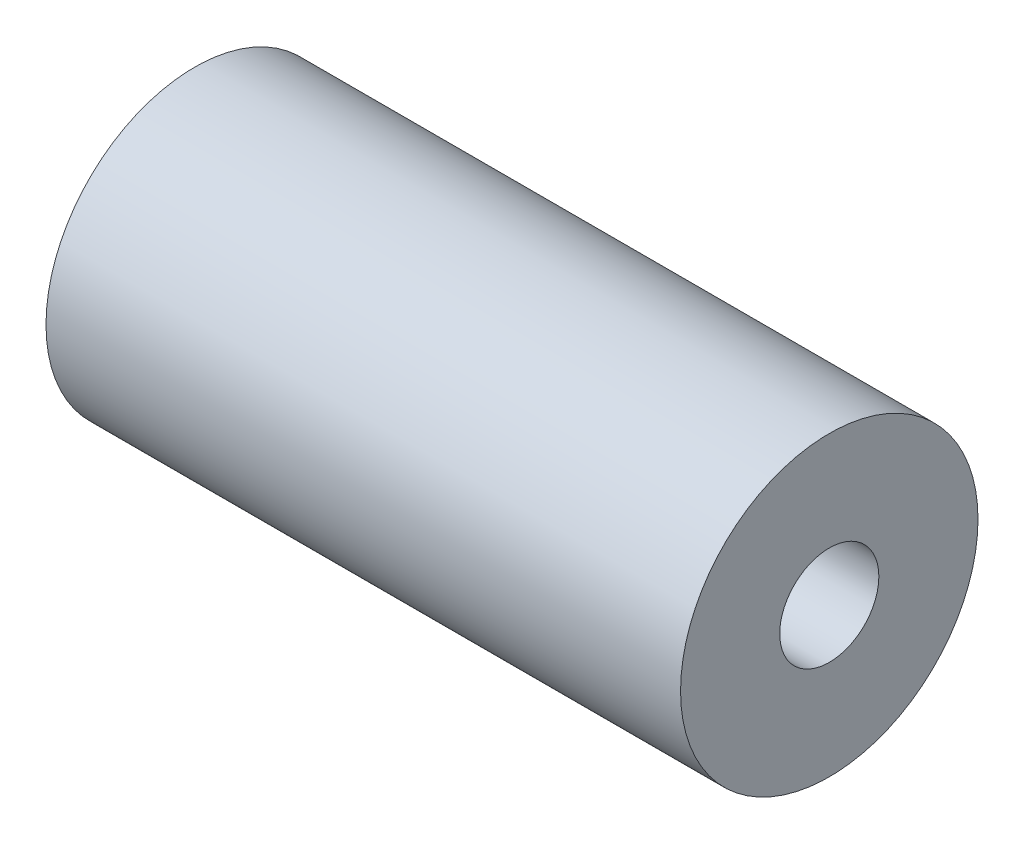
ISO-10303-21;
HEADER;
FILE_DESCRIPTION(('STEP AP214'),'2;1');
FILE_NAME('part.step','',(''),(''),'','','');
FILE_SCHEMA(('AUTOMOTIVE_DESIGN { 1 0 10303 214 1 1 1 1 }'));
ENDSEC;
DATA;
#1=APPLICATION_CONTEXT('core data for automotive mechanical design processes');
#2=APPLICATION_PROTOCOL_DEFINITION('international standard','automotive_design',2000,#1);
#3=PRODUCT_CONTEXT('',#1,'mechanical');
#4=PRODUCT('Part','Part','',(#3));
#5=PRODUCT_RELATED_PRODUCT_CATEGORY('part','',(#4));
#6=PRODUCT_DEFINITION_FORMATION('','',#4);
#7=PRODUCT_DEFINITION_CONTEXT('part definition',#1,'design');
#8=PRODUCT_DEFINITION('design','',#6,#7);
#9=PRODUCT_DEFINITION_SHAPE('','',#8);
#10=(LENGTH_UNIT() NAMED_UNIT(*) SI_UNIT(.MILLI.,.METRE.));
#11=(NAMED_UNIT(*) PLANE_ANGLE_UNIT() SI_UNIT($,.RADIAN.));
#12=(NAMED_UNIT(*) SI_UNIT($,.STERADIAN.) SOLID_ANGLE_UNIT());
#13=UNCERTAINTY_MEASURE_WITH_UNIT(LENGTH_MEASURE(1.E-05),#10,'distance_accuracy_value','');
#14=(GEOMETRIC_REPRESENTATION_CONTEXT(3) GLOBAL_UNCERTAINTY_ASSIGNED_CONTEXT((#13)) GLOBAL_UNIT_ASSIGNED_CONTEXT((#10,
#11,#12)) REPRESENTATION_CONTEXT('',''));
#15=CARTESIAN_POINT('',(0.,0.,0.));
#16=DIRECTION('',(0.,0.,1.));
#17=DIRECTION('',(1.,0.,0.));
#18=AXIS2_PLACEMENT_3D('',#15,#16,#17);
#19=CARTESIAN_POINT('',(0.,0.,0.));
#20=DIRECTION('',(-1.,0.,0.));
#21=DIRECTION('',(0.,0.,1.));
#22=AXIS2_PLACEMENT_3D('',#19,#20,#21);
#23=PLANE('',#22);
#24=CARTESIAN_POINT('',(0.,7.5,0.));
#25=DIRECTION('',(-1.,0.,0.));
#26=DIRECTION('',(0.,0.,1.));
#27=AXIS2_PLACEMENT_3D('',#24,#25,#26);
#28=CIRCLE('',#27,4.);
#29=CARTESIAN_POINT('',(0.,7.5,4.));
#30=VERTEX_POINT('',#29);
#31=EDGE_CURVE('E74',#30,#30,#28,.T.);
#32=ORIENTED_EDGE('',*,*,#31,.F.);
#33=EDGE_LOOP('',(#32));
#34=FACE_BOUND('',#33,.T.);
#35=CARTESIAN_POINT('',(0.,7.5,0.));
#36=DIRECTION('',(-1.,0.,0.));
#37=DIRECTION('',(0.,0.,1.));
#38=AXIS2_PLACEMENT_3D('',#35,#36,#37);
#39=CIRCLE('',#38,7.5);
#40=CARTESIAN_POINT('',(0.,7.5,7.5));
#41=VERTEX_POINT('',#40);
#42=EDGE_CURVE('E49',#41,#41,#39,.T.);
#43=ORIENTED_EDGE('',*,*,#42,.T.);
#44=EDGE_LOOP('',(#43));
#45=FACE_BOUND('',#44,.T.);
#46=ADVANCED_FACE('F31',(#34,#45),#23,.T.);
#47=CARTESIAN_POINT('',(32.,0.,0.));
#48=DIRECTION('',(1.,0.,0.));
#49=DIRECTION('',(0.,0.,-1.));
#50=AXIS2_PLACEMENT_3D('',#47,#48,#49);
#51=PLANE('',#50);
#52=CARTESIAN_POINT('',(32.,7.5,0.));
#53=DIRECTION('',(1.,0.,0.));
#54=DIRECTION('',(0.,0.,-1.));
#55=AXIS2_PLACEMENT_3D('',#52,#53,#54);
#56=CIRCLE('',#55,2.5);
#57=CARTESIAN_POINT('',(32.,7.5,-2.5));
#58=VERTEX_POINT('',#57);
#59=EDGE_CURVE('E113',#58,#58,#56,.T.);
#60=ORIENTED_EDGE('',*,*,#59,.F.);
#61=EDGE_LOOP('',(#60));
#62=FACE_BOUND('',#61,.T.);
#63=CARTESIAN_POINT('',(32.,7.5,0.));
#64=DIRECTION('',(-1.,0.,0.));
#65=DIRECTION('',(0.,0.,1.));
#66=AXIS2_PLACEMENT_3D('',#63,#64,#65);
#67=CIRCLE('',#66,7.5);
#68=CARTESIAN_POINT('',(32.,7.5,7.5));
#69=VERTEX_POINT('',#68);
#70=EDGE_CURVE('E45',#69,#69,#67,.T.);
#71=ORIENTED_EDGE('',*,*,#70,.F.);
#72=EDGE_LOOP('',(#71));
#73=FACE_BOUND('',#72,.T.);
#74=ADVANCED_FACE('F99',(#62,#73),#51,.T.);
#75=CARTESIAN_POINT('',(0.,7.5,0.));
#76=DIRECTION('',(-1.,0.,0.));
#77=DIRECTION('',(0.,0.,1.));
#78=AXIS2_PLACEMENT_3D('',#75,#76,#77);
#79=CYLINDRICAL_SURFACE('',#78,7.5);
#80=CARTESIAN_POINT('',(21.8948376849199,0.127034375311061,-1.37454643324816));
#81=CARTESIAN_POINT('',(21.9396366804073,0.127033669678591,-1.37454454974336));
#82=CARTESIAN_POINT('',(21.9844649005086,0.126335435929491,-1.37081360893162));
#83=CARTESIAN_POINT('',(22.0728773128334,0.123594332355136,-1.35598454538326));
#84=CARTESIAN_POINT('',(22.1164600976131,0.12154999951508,-1.34487840676248));
#85=CARTESIAN_POINT('',(22.2010885606705,0.116276986451894,-1.3156192732532));
#86=CARTESIAN_POINT('',(22.2421358035722,0.113049045311589,-1.29747067548985));
#87=CARTESIAN_POINT('',(22.3205603042399,0.105654062927296,-1.25463868712342));
#88=CARTESIAN_POINT('',(22.3579382640353,0.101487201827812,-1.22995654990976));
#89=CARTESIAN_POINT('',(22.4281256050641,0.0925024621685979,-1.17463445977181));
#90=CARTESIAN_POINT('',(22.4609177382888,0.087682253331125,-1.14397300048474));
#91=CARTESIAN_POINT('',(22.5208539322878,0.0777416884137909,-1.0775924775697));
#92=CARTESIAN_POINT('',(22.5479977292417,0.0726213183284178,-1.04187317783284));
#93=CARTESIAN_POINT('',(22.595927006422,0.0624077454710151,-0.966270010170992));
#94=CARTESIAN_POINT('',(22.6166971220944,0.057314636981452,-0.926376384878735));
#95=CARTESIAN_POINT('',(22.6511911296129,0.0474798915567518,-0.843610610398594));
#96=CARTESIAN_POINT('',(22.6649152151268,0.0427382449643711,-0.800738543113176));
#97=CARTESIAN_POINT('',(22.6848767260857,0.0338777075533017,-0.713397714658946));
#98=CARTESIAN_POINT('',(22.6911425864745,0.0297565041257474,-0.668935687896691));
#99=CARTESIAN_POINT('',(22.6960978001374,0.0222891462580487,-0.579527672329052));
#100=CARTESIAN_POINT('',(22.6947873748193,0.0189429691716612,-0.534581697704778));
#101=CARTESIAN_POINT('',(22.6846502248455,0.0131214264281381,-0.44567529373342));
#102=CARTESIAN_POINT('',(22.6758540773064,0.0106425760243152,-0.401711600701624));
#103=CARTESIAN_POINT('',(22.6510428484536,0.00652943755140779,-0.315829707862688));
#104=CARTESIAN_POINT('',(22.6350276623999,0.0048951617368526,-0.273911537743475));
#105=CARTESIAN_POINT('',(22.5961996909762,0.00238048653736678,-0.193224980839641));
#106=CARTESIAN_POINT('',(22.5733734481273,0.00150159312454225,-0.154463025010223));
#107=CARTESIAN_POINT('',(22.5215810916925,0.000350918996138655,-0.0812739742174994));
#108=CARTESIAN_POINT('',(22.4926147730768,7.9158557485031E-05,-0.0468470240702225));
#109=CARTESIAN_POINT('',(22.4291927177675,-4.91841518185454E-05,0.0168590372776053));
#110=CARTESIAN_POINT('',(22.3947103693288,9.63073276275467E-05,0.0461116660187261));
#111=CARTESIAN_POINT('',(22.3213271378044,0.000599991840734735,0.0984168503188172));
#112=CARTESIAN_POINT('',(22.2824262467709,0.00095818525699306,0.121469394725289));
#113=CARTESIAN_POINT('',(22.2012889731745,0.00169615299414734,0.160706265206955));
#114=CARTESIAN_POINT('',(22.1590517368245,0.00207593283209638,0.176888826422012));
#115=CARTESIAN_POINT('',(22.0724513598548,0.00270737441486791,0.201893882630277));
#116=CARTESIAN_POINT('',(22.0280882932016,0.00295904061376316,0.210716633505715));
#117=CARTESIAN_POINT('',(21.938729103775,0.00324656571895139,0.220710853366206));
#118=CARTESIAN_POINT('',(21.8937371665854,0.0032834797222393,0.221919732420322));
#119=CARTESIAN_POINT('',(21.804192464152,0.00313224581596679,0.216749400842273));
#120=CARTESIAN_POINT('',(21.7596396921507,0.00294410137488606,0.210370307151871));
#121=CARTESIAN_POINT('',(21.6723472347838,0.00240649792906005,0.19024092155425));
#122=CARTESIAN_POINT('',(21.6296034423609,0.0020574284082058,0.176508414084542));
#123=CARTESIAN_POINT('',(21.5470144187684,0.00132643829959189,0.142089378046419));
#124=CARTESIAN_POINT('',(21.5071692628475,0.000944516859555432,0.121402669024755));
#125=CARTESIAN_POINT('',(21.4313392433908,0.000322839016266201,0.0735821045815267));
#126=CARTESIAN_POINT('',(21.3953699087791,8.36382623002651E-05,0.0464236193311508));
#127=CARTESIAN_POINT('',(21.3284702812716,-4.75476606736865E-05,-0.013518938896719));
#128=CARTESIAN_POINT('',(21.2975401305037,6.04769618792033E-05,-0.0463031704924268));
#129=CARTESIAN_POINT('',(21.2414679362849,0.000825357463263427,-0.116712930913958));
#130=CARTESIAN_POINT('',(21.2163502147453,0.0014844681491873,-0.154357811481308));
#131=CARTESIAN_POINT('',(21.1727834708178,0.00352589250307418,-0.233309206189873));
#132=CARTESIAN_POINT('',(21.1543343462098,0.00490819508475142,-0.27461566419229));
#133=CARTESIAN_POINT('',(21.1246694546675,0.00850637981289864,-0.359621917177984));
#134=CARTESIAN_POINT('',(21.1134391538161,0.0107205727445,-0.403316709855326));
#135=CARTESIAN_POINT('',(21.0984832983021,0.0160182620602749,-0.491920732962376));
#136=CARTESIAN_POINT('',(21.0947575015823,0.0191017304023669,-0.536829924174381));
#137=CARTESIAN_POINT('',(21.0949200906716,0.0260656614954151,-0.626347496211128));
#138=CARTESIAN_POINT('',(21.0987707827256,0.0299420932129754,-0.670956263852995));
#139=CARTESIAN_POINT('',(21.1138978063328,0.0383565126663608,-0.758831649405844));
#140=CARTESIAN_POINT('',(21.1251741413921,0.0428945007145655,-0.802098266683066));
#141=CARTESIAN_POINT('',(21.1548215586442,0.0524050020323546,-0.886067331435876));
#142=CARTESIAN_POINT('',(21.1731913604409,0.0573774367575171,-0.926770240128628));
#143=CARTESIAN_POINT('',(21.2165002968741,0.0674683004454969,-1.00449505984943));
#144=CARTESIAN_POINT('',(21.2414394220954,0.072586729199068,-1.04151697615293));
#145=CARTESIAN_POINT('',(21.2973200596777,0.082666028271536,-1.11103484772124));
#146=CARTESIAN_POINT('',(21.3282896559418,0.0876260298631097,-1.1435083549059));
#147=CARTESIAN_POINT('',(21.3952956718187,0.0970211064518984,-1.20283337764026));
#148=CARTESIAN_POINT('',(21.4313333011807,0.10145605565121,-1.22968354706828));
#149=CARTESIAN_POINT('',(21.5075667805944,0.109488827676322,-1.27707706606776));
#150=CARTESIAN_POINT('',(21.5477742127747,0.113084223450952,-1.29760218402584));
#151=CARTESIAN_POINT('',(21.631097743183,0.119144764510532,-1.33164473218176));
#152=CARTESIAN_POINT('',(21.674210527918,0.121611173168307,-1.345169997665));
#153=CARTESIAN_POINT('',(21.7471083772976,0.124611004840617,-1.36149848131423));
#154=CARTESIAN_POINT('',(21.7764287983702,0.125516719984812,-1.36638483102117));
#155=CARTESIAN_POINT('',(21.8354410928893,0.126728637676304,-1.37290942339032));
#156=CARTESIAN_POINT('',(21.8651329644957,0.127034843192428,-1.3745476821374));
#157=CARTESIAN_POINT('',(21.8948376849199,0.127034375311061,-1.37454643324816));
#158=B_SPLINE_CURVE_WITH_KNOTS('',3,(#80,#81,#82,#83,#84,#85,#86,#87,#88,#89,#90,#91,#92,#93,
#94,#95,#96,#97,#98,#99,#100,#101,#102,#103,#104,#105,#106,#107,#108,#109,#110,#111,#112,#113,
#114,#115,#116,#117,#118,#119,#120,#121,#122,#123,#124,#125,#126,#127,#128,#129,#130,#131,#132,
#133,#134,#135,#136,#137,#138,#139,#140,#141,#142,#143,#144,#145,#146,#147,#148,#149,#150,#151,
#152,#153,#154,#155,#156,#157),.UNSPECIFIED.,.T.,.F.,(4,2,2,2,2,2,2,2,2,2,2,2,2,2,2,2,2,2,2,2,2,
2,2,2,2,2,2,2,2,2,2,2,2,2,2,2,2,2,4),(0.,0.134288500764562,0.268723195130981,0.403074086739529,
0.537399223226478,0.672216719567014,0.807040511501335,0.942186805119124,1.07732938389651,
1.21195505583987,1.34657679352932,1.48065126334192,1.6147276784811,1.74907077980834,
1.88341836783692,2.0184348213682,2.15345151776081,2.28850287822712,2.42354954309911,
2.55793214740977,2.6923126807147,2.82636966920784,2.96043013658872,3.09500918758138,
3.2295920336611,3.36472824498417,3.49986238477577,3.63472359486195,3.76958045493854,
3.90376808558237,4.03795577958832,4.17211926355396,4.30628255523929,4.44108627024394,
4.575922217941,4.71114326391143,4.84621262103366,4.93525529000542,5.02429751802834),.UNSPECIFIED.);
#159=CARTESIAN_POINT('',(21.8948376849199,0.127034375311061,-1.37454643324816));
#160=VERTEX_POINT('',#159);
#161=EDGE_CURVE('E10',#160,#160,#158,.T.);
#162=ORIENTED_EDGE('',*,*,#161,.F.);
#163=EDGE_LOOP('',(#162));
#164=FACE_BOUND('',#163,.T.);
#165=CARTESIAN_POINT('',(12.7888398509639,0.0773810377946126,-1.07458258961748));
#166=CARTESIAN_POINT('',(12.8336388464513,0.0773804090824827,-1.07458067906035));
#167=CARTESIAN_POINT('',(12.8784670665526,0.0768339681929759,-1.07082450386963));
#168=CARTESIAN_POINT('',(12.9668794788775,0.074696155183762,-1.05589652577264));
#169=CARTESIAN_POINT('',(13.0104622636572,0.0731036461439832,-1.04471665427144));
#170=CARTESIAN_POINT('',(13.0950907267146,0.0690208706658251,-1.01526784266769));
#171=CARTESIAN_POINT('',(13.1361379696162,0.0665311644826636,-0.997003326032898));
#172=CARTESIAN_POINT('',(13.214562470284,0.0608782859820511,-0.953906806956019));
#173=CARTESIAN_POINT('',(13.2519404300793,0.0577152428598314,-0.929076064174881));
#174=CARTESIAN_POINT('',(13.3221277711081,0.0509801508874901,-0.87343527212355));
#175=CARTESIAN_POINT('',(13.3549199043328,0.0474066453508344,-0.842603639714143));
#176=CARTESIAN_POINT('',(13.4148560983318,0.0401647238997315,-0.775874761205312));
#177=CARTESIAN_POINT('',(13.4419998952858,0.036496303561032,-0.739977278623362));
#178=CARTESIAN_POINT('',(13.4899291724661,0.0293554023694127,-0.664022268510859));
#179=CARTESIAN_POINT('',(13.5106992881384,0.025883411198236,-0.623954995452255));
#180=CARTESIAN_POINT('',(13.545193295657,0.019411334424365,-0.540858618484908));
#181=CARTESIAN_POINT('',(13.5589173811709,0.0164112358527664,-0.497829596019912));
#182=CARTESIAN_POINT('',(13.5788788921298,0.011097998497641,-0.410201410217099));
#183=CARTESIAN_POINT('',(13.5851447525186,0.00878227605271943,-0.365608882019464));
#184=CARTESIAN_POINT('',(13.5900999661814,0.00494485878533377,-0.275971674845303));
#185=CARTESIAN_POINT('',(13.5887895408633,0.00342314076045975,-0.230927009120358));
#186=CARTESIAN_POINT('',(13.5786523908896,0.00120985534845849,-0.141857708041265));
#187=CARTESIAN_POINT('',(13.5698562433505,0.000514938358843425,-0.0978296704436612));
#188=CARTESIAN_POINT('',(13.5450450144976,-0.00011393335547129,-0.011851638679362));
#189=CARTESIAN_POINT('',(13.529029828444,-4.78770389955771E-05,0.030098325327111));
#190=CARTESIAN_POINT('',(13.4902018570203,0.00070982838833379,0.11082050281781));
#191=CARTESIAN_POINT('',(13.4673756141714,0.00140272158016566,0.1495862295926));
#192=CARTESIAN_POINT('',(13.4155832577366,0.00321942513839036,0.222761777387414));
#193=CARTESIAN_POINT('',(13.3866169391208,0.00434324989549488,0.257171452888564));
#194=CARTESIAN_POINT('',(13.3231948838115,0.00679708888252273,0.32083036741379));
#195=CARTESIAN_POINT('',(13.2887125353729,0.00812810179549549,0.350053061688309));
#196=CARTESIAN_POINT('',(13.2153293038485,0.0107513586574088,0.402294850767471));
#197=CARTESIAN_POINT('',(13.176428412815,0.0120436025366093,0.425313934413273));
#198=CARTESIAN_POINT('',(13.0952911392186,0.0143712770769869,0.464488652444297));
#199=CARTESIAN_POINT('',(13.0530539028686,0.015406641718975,0.480642523195993));
#200=CARTESIAN_POINT('',(12.9664535258988,0.0170510466660651,0.505601439174476));
#201=CARTESIAN_POINT('',(12.9220904592456,0.017660101792766,0.5144067398927));
#202=CARTESIAN_POINT('',(12.8327312698191,0.0183524672769187,0.52438109357313));
#203=CARTESIAN_POINT('',(12.7877393326295,0.0184383481353201,0.525587483099477));
#204=CARTESIAN_POINT('',(12.6981946301961,0.0180776793163977,0.520427529773678));
#205=CARTESIAN_POINT('',(12.6536418581948,0.0176311378444809,0.514061303626619));
#206=CARTESIAN_POINT('',(12.5663494008279,0.0162781101795894,0.493970248449235));
#207=CARTESIAN_POINT('',(12.523605608405,0.0153727339731313,0.480263173456345));
#208=CARTESIAN_POINT('',(12.4410165848124,0.0132473034187541,0.445902048135847));
#209=CARTESIAN_POINT('',(12.4011714288916,0.0120272409052914,0.425247817537817));
#210=CARTESIAN_POINT('',(12.3253414094349,0.00946785421101088,0.377491745601791));
#211=CARTESIAN_POINT('',(12.2893720748232,0.00812808694903277,0.350365272152792));
#212=CARTESIAN_POINT('',(12.2224724473157,0.00556747148144316,0.290477287171871));
#213=CARTESIAN_POINT('',(12.1915422965478,0.00434662663037719,0.257715616755212));
#214=CARTESIAN_POINT('',(12.135470102329,0.00225709413413333,0.187332712163642));
#215=CARTESIAN_POINT('',(12.1103523807894,0.00138987509600626,0.14969205075917));
#216=CARTESIAN_POINT('',(12.0667856368618,0.000229635722456739,0.0707227910157976));
#217=CARTESIAN_POINT('',(12.0483365122539,-6.33934147748254E-05,0.0293942492189047));
#218=CARTESIAN_POINT('',(12.0186716207116,8.64383432290069E-05,-0.0556879905873551));
#219=CARTESIAN_POINT('',(12.0074413198601,0.000527814160583453,-0.0994366219355719));
#220=CARTESIAN_POINT('',(11.9924854643462,0.00222993243352646,-0.188182558271982));
#221=CARTESIAN_POINT('',(11.9887596676264,0.00349064845961274,-0.233179822938122));
#222=CARTESIAN_POINT('',(11.9889222567157,0.00682061218603622,-0.322906092119469));
#223=CARTESIAN_POINT('',(11.9927729487697,0.0088858164872472,-0.367635319751759));
#224=CARTESIAN_POINT('',(12.0078999723768,0.0137316362868232,-0.455779541747699));
#225=CARTESIAN_POINT('',(12.0191763074362,0.0165122521229982,-0.49919453549077));
#226=CARTESIAN_POINT('',(12.0488237246882,0.022611580559819,-0.583480071992575));
#227=CARTESIAN_POINT('',(12.067193526485,0.0259301959869494,-0.624351072405989));
#228=CARTESIAN_POINT('',(12.1105024629181,0.032862495967189,-0.70242101763195));
#229=CARTESIAN_POINT('',(12.1354415881394,0.0364761800974046,-0.739619967707127));
#230=CARTESIAN_POINT('',(12.1913222257217,0.0437295615357478,-0.809489239886612));
#231=CARTESIAN_POINT('',(12.2222918219859,0.0473693006756075,-0.842137097146378));
#232=CARTESIAN_POINT('',(12.2892978378628,0.0543521491651214,-0.901794163898895));
#233=CARTESIAN_POINT('',(12.3253354672247,0.0576951873800253,-0.928802023277375));
#234=CARTESIAN_POINT('',(12.4015689466385,0.063800447617665,-0.976482174986362));
#235=CARTESIAN_POINT('',(12.4417763788187,0.0665609835307913,-0.997136152313782));
#236=CARTESIAN_POINT('',(12.525099909227,0.071236762856831,-1.03139636729527));
#237=CARTESIAN_POINT('',(12.5682126939621,0.0731529510317527,-1.04501048500218));
#238=CARTESIAN_POINT('',(12.6411105433417,0.0754885064021935,-1.06144713762541));
#239=CARTESIAN_POINT('',(12.6704309644142,0.0761954282104582,-1.06636618173356));
#240=CARTESIAN_POINT('',(12.7294432589334,0.0771419011884685,-1.07293453304698));
#241=CARTESIAN_POINT('',(12.7591351305398,0.0773814546726662,-1.07458385644422));
#242=CARTESIAN_POINT('',(12.7888398509639,0.0773810377946126,-1.07458258961748));
#243=B_SPLINE_CURVE_WITH_KNOTS('',3,(#165,#166,#167,#168,#169,#170,#171,#172,#173,#174,#175,
#176,#177,#178,#179,#180,#181,#182,#183,#184,#185,#186,#187,#188,#189,#190,#191,#192,#193,#194,
#195,#196,#197,#198,#199,#200,#201,#202,#203,#204,#205,#206,#207,#208,#209,#210,#211,#212,#213,
#214,#215,#216,#217,#218,#219,#220,#221,#222,#223,#224,#225,#226,#227,#228,#229,#230,#231,#232,
#233,#234,#235,#236,#237,#238,#239,#240,#241,#242),.UNSPECIFIED.,.T.,.F.,(4,2,2,2,2,2,2,2,2,2,2,
2,2,2,2,2,2,2,2,2,2,2,2,2,2,2,2,2,2,2,2,2,2,2,2,2,2,2,4),(0.,0.13428850076456,0.268723195130977,
0.403074086739521,0.53739922322647,0.672216719567005,0.807040511501326,0.942186805119117,
1.0773293838965,1.21195505583986,1.34657679352932,1.48065126334192,1.61472767848109,
1.74907077980833,1.88341836783691,2.01843482136819,2.1534515177608,2.28850287822711,
2.4235495430991,2.55793214740976,2.69231268071469,2.82636966920783,2.96043013658871,
3.09500918758137,3.22959203366109,3.36472824498416,3.49986238477576,3.63472359486194,
3.76958045493853,3.90376808558236,4.03795577958831,4.17211926355396,4.30628255523928,
4.44108627024394,4.57592221794099,4.71114326391142,4.84621262103365,4.93525529000542,
5.02429751802833),.UNSPECIFIED.);
#244=CARTESIAN_POINT('',(12.7888398509639,0.0773810377946126,-1.07458258961748));
#245=VERTEX_POINT('',#244);
#246=EDGE_CURVE('E41',#245,#245,#243,.T.);
#247=ORIENTED_EDGE('',*,*,#246,.F.);
#248=EDGE_LOOP('',(#247));
#249=FACE_BOUND('',#248,.T.);
#250=ORIENTED_EDGE('',*,*,#70,.T.);
#251=EDGE_LOOP('',(#250));
#252=FACE_BOUND('',#251,.T.);
#253=ORIENTED_EDGE('',*,*,#42,.F.);
#254=EDGE_LOOP('',(#253));
#255=FACE_BOUND('',#254,.T.);
#256=ADVANCED_FACE('F55',(#164,#249,#252,#255),#79,.T.);
#257=CARTESIAN_POINT('',(10.,7.5,0.));
#258=DIRECTION('',(1.,0.,0.));
#259=DIRECTION('',(0.,0.,-1.));
#260=AXIS2_PLACEMENT_3D('',#257,#258,#259);
#261=CYLINDRICAL_SURFACE('',#260,2.5);
#262=CARTESIAN_POINT('',(21.8948376849199,5.20044931914359,-0.980849971286555));
#263=CARTESIAN_POINT('',(21.9385208038976,5.20044917200732,-0.980849854191016));
#264=CARTESIAN_POINT('',(21.9822054367559,5.19895353747942,-0.97736521671921));
#265=CARTESIAN_POINT('',(22.0682874786936,5.19313615762207,-0.96355277110701));
#266=CARTESIAN_POINT('',(22.1106845867474,5.18881375663274,-0.953223375338375));
#267=CARTESIAN_POINT('',(22.1929317357531,5.17781037162129,-0.92609246801036));
#268=CARTESIAN_POINT('',(22.2327862975743,5.17113371998907,-0.909302839696891));
#269=CARTESIAN_POINT('',(22.3090465054274,5.15606955530056,-0.86973363246223));
#270=CARTESIAN_POINT('',(22.3454514851033,5.14768171267605,-0.846952899434656));
#271=CARTESIAN_POINT('',(22.4150908824867,5.12965223488798,-0.795126884814125));
#272=CARTESIAN_POINT('',(22.4481827676575,5.11997857893403,-0.765901173903505));
#273=CARTESIAN_POINT('',(22.5089808978515,5.10045476762028,-0.70234356212565));
#274=CARTESIAN_POINT('',(22.5366863522309,5.09060458658077,-0.668010912943166));
#275=CARTESIAN_POINT('',(22.5865603775699,5.07132388628501,-0.594155713904153));
#276=CARTESIAN_POINT('',(22.6085812595745,5.06190896273094,-0.554528978961901));
#277=CARTESIAN_POINT('',(22.6454869669027,5.04455578550246,-0.471781277133553));
#278=CARTESIAN_POINT('',(22.6603735558012,5.03661716718724,-0.428661176880729));
#279=CARTESIAN_POINT('',(22.682109574534,5.02306904893873,-0.341599707608028));
#280=CARTESIAN_POINT('',(22.6892028137507,5.01739266746597,-0.297729719957102));
#281=CARTESIAN_POINT('',(22.6959242376704,5.008370439222,-0.209189731331162));
#282=CARTESIAN_POINT('',(22.6955541993208,5.00502403789729,-0.164519923317565));
#283=CARTESIAN_POINT('',(22.6875179339337,5.00083008390148,-0.077367180254028));
#284=CARTESIAN_POINT('',(22.6801161859995,4.99989649756218,-0.0348635992378459));
#285=CARTESIAN_POINT('',(22.6586617732993,5.00012188127856,0.0484204575355614));
#286=CARTESIAN_POINT('',(22.6446086680919,5.00128098992315,0.0892008189893768));
#287=CARTESIAN_POINT('',(22.6100860686609,5.00536222799434,0.168458512056131));
#288=CARTESIAN_POINT('',(22.5895380941231,5.00830634882071,0.206900425413798));
#289=CARTESIAN_POINT('',(22.5426725814706,5.01545362776843,0.279962215005254));
#290=CARTESIAN_POINT('',(22.5163535311846,5.01965711598264,0.314581085921324));
#291=CARTESIAN_POINT('',(22.4573438640532,5.02890215585821,0.380571295021205));
#292=CARTESIAN_POINT('',(22.424425503391,5.03397225352853,0.411735270150886));
#293=CARTESIAN_POINT('',(22.3538435544301,5.04405631431714,0.468149507344798));
#294=CARTESIAN_POINT('',(22.3161793501424,5.04907027005631,0.493399000517509));
#295=CARTESIAN_POINT('',(22.236559314773,5.05835598948809,0.537485242620953));
#296=CARTESIAN_POINT('',(22.1945566472314,5.06261793047707,0.556239821655784));
#297=CARTESIAN_POINT('',(22.1078272817246,5.06965068455261,0.586209813726216));
#298=CARTESIAN_POINT('',(22.0631016263274,5.07242206439269,0.597428092680906));
#299=CARTESIAN_POINT('',(21.9742057298797,5.07594438096521,0.611559880029179));
#300=CARTESIAN_POINT('',(21.9300908607629,5.07677517764664,0.61480194692359));
#301=CARTESIAN_POINT('',(21.8419555496516,5.07652290650764,0.61380724870069));
#302=CARTESIAN_POINT('',(21.7979350933697,5.07544015224623,0.609571708881944));
#303=CARTESIAN_POINT('',(21.7126491712436,5.07159125818406,0.594046196946602));
#304=CARTESIAN_POINT('',(21.6713406115694,5.06887798137769,0.582977467414012));
#305=CARTESIAN_POINT('',(21.591132105051,5.0621992954524,0.554384180255889));
#306=CARTESIAN_POINT('',(21.5522325647349,5.05823367568242,0.536858536458736));
#307=CARTESIAN_POINT('',(21.4766637613386,5.04945861644863,0.495287566146158));
#308=CARTESIAN_POINT('',(21.4400954055151,5.04462756605966,0.47106363617781));
#309=CARTESIAN_POINT('',(21.371350973828,5.03487663238607,0.417036057698733));
#310=CARTESIAN_POINT('',(21.3391760979157,5.02995672524659,0.387230890085158));
#311=CARTESIAN_POINT('',(21.2786781296027,5.02051107195501,0.321382416623758));
#312=CARTESIAN_POINT('',(21.250585284128,5.01601200549843,0.285123161341717));
#313=CARTESIAN_POINT('',(21.2007951462815,5.00839570335941,0.208315135408807));
#314=CARTESIAN_POINT('',(21.1790975808591,5.00527840867845,0.167766547994245));
#315=CARTESIAN_POINT('',(21.142919686286,5.00105448520194,0.0838064079934632));
#316=CARTESIAN_POINT('',(21.128388625713,4.99993357192416,0.0404175169556718));
#317=CARTESIAN_POINT('',(21.1068456328645,5.00007245667171,-0.0481820725100939));
#318=CARTESIAN_POINT('',(21.0998312212564,5.00133146931029,-0.0933921651144709));
#319=CARTESIAN_POINT('',(21.09372983097,5.0062703567922,-0.182224000992183));
#320=CARTESIAN_POINT('',(21.0943110274049,5.00984245372256,-0.225829207022965));
#321=CARTESIAN_POINT('',(21.102576227309,5.01918045091147,-0.312117553749078));
#322=CARTESIAN_POINT('',(21.11025972882,5.02494619611617,-0.354800759388965));
#323=CARTESIAN_POINT('',(21.1322968203028,5.03822271197661,-0.437473842877807));
#324=CARTESIAN_POINT('',(21.1465578711427,5.04570857192985,-0.477492545313658));
#325=CARTESIAN_POINT('',(21.181260989706,5.06194584666281,-0.554473884837335));
#326=CARTESIAN_POINT('',(21.2017041408371,5.0706974831284,-0.591435984811194));
#327=CARTESIAN_POINT('',(21.2490182388126,5.08914212866095,-0.662696822804768));
#328=CARTESIAN_POINT('',(21.2760893030222,5.09885737733206,-0.696856867603619));
#329=CARTESIAN_POINT('',(21.3355423228399,5.11816696268018,-0.760244308459309));
#330=CARTESIAN_POINT('',(21.3679259047665,5.12776126135925,-0.789470188446017));
#331=CARTESIAN_POINT('',(21.4384510077383,5.14632722645182,-0.843245787372955));
#332=CARTESIAN_POINT('',(21.476755185957,5.15526505030295,-0.86759449533618));
#333=CARTESIAN_POINT('',(21.5572300377548,5.17123862074298,-0.909603317018145));
#334=CARTESIAN_POINT('',(21.5993993304357,5.17827504312994,-0.927265808056118));
#335=CARTESIAN_POINT('',(21.6833291054767,5.18927956046272,-0.954342726027684));
#336=CARTESIAN_POINT('',(21.7249052628762,5.1934303230703,-0.964254525142222));
#337=CARTESIAN_POINT('',(21.8092665843479,5.19901489625904,-0.977507290429051));
#338=CARTESIAN_POINT('',(21.8520514084555,5.20044946325906,-0.980850085978047));
#339=CARTESIAN_POINT('',(21.8948376849199,5.20044931914359,-0.980849971286555));
#340=B_SPLINE_CURVE_WITH_KNOTS('',3,(#262,#263,#264,#265,#266,#267,#268,#269,#270,#271,#272,
#273,#274,#275,#276,#277,#278,#279,#280,#281,#282,#283,#284,#285,#286,#287,#288,#289,#290,#291,
#292,#293,#294,#295,#296,#297,#298,#299,#300,#301,#302,#303,#304,#305,#306,#307,#308,#309,#310,
#311,#312,#313,#314,#315,#316,#317,#318,#319,#320,#321,#322,#323,#324,#325,#326,#327,#328,#329,
#330,#331,#332,#333,#334,#335,#336,#337,#338,#339),.UNSPECIFIED.,.T.,.F.,(4,2,2,2,2,2,2,2,2,2,2,
2,2,2,2,2,2,2,2,2,2,2,2,2,2,2,2,2,2,2,2,2,2,2,2,2,2,2,4),(0.,0.130891168523664,
0.261812707628661,0.392494566159158,0.523201617269222,0.658181086047294,0.793180352769163,
0.931396887417823,1.06957923772488,1.20330337206031,1.33699566811544,1.46585063697655,
1.5947141395825,1.72519845034169,1.85571699231554,1.99192534158374,2.12815138832635,
2.26604280905129,2.40388176242564,2.53593995660067,2.66797651341177,2.79594728163428,
2.92393958672764,3.05574326637471,3.18758287266625,3.32519336185686,3.46279797482663,
3.59941398434423,3.73598491780592,3.86661026401423,3.99722637893302,4.12605842929881,
4.25491307046653,4.38828245677264,4.52169274783304,4.65980300496366,4.79786411004772,
4.92610371676323,5.05430760545675),.UNSPECIFIED.);
#341=CARTESIAN_POINT('',(21.8948376849199,5.20044931914359,-0.980849971286555));
#342=VERTEX_POINT('',#341);
#343=EDGE_CURVE('E75',#342,#342,#340,.T.);
#344=ORIENTED_EDGE('',*,*,#343,.T.);
#345=EDGE_LOOP('',(#344));
#346=FACE_BOUND('',#345,.T.);
#347=CARTESIAN_POINT('',(12.7888398509639,5.16258399083547,-0.886840684735068));
#348=CARTESIAN_POINT('',(12.8325229699416,5.16258384856611,-0.886840561772155));
#349=CARTESIAN_POINT('',(12.8762076028,5.16123067919649,-0.883298168004082));
#350=CARTESIAN_POINT('',(12.9622896447376,5.15597791311407,-0.869261287628514));
#351=CARTESIAN_POINT('',(13.0046867527914,5.15207772562846,-0.858765188122757));
#352=CARTESIAN_POINT('',(13.0869339017972,5.14218302764541,-0.831210595656604));
#353=CARTESIAN_POINT('',(13.1267884636184,5.13619236433692,-0.814164151773883));
#354=CARTESIAN_POINT('',(13.2030486714715,5.12274436138812,-0.774016892395052));
#355=CARTESIAN_POINT('',(13.2394536511473,5.11528673922761,-0.750914910383154));
#356=CARTESIAN_POINT('',(13.3090930485307,5.09937264163116,-0.698400727932614));
#357=CARTESIAN_POINT('',(13.3421849337015,5.09089148471432,-0.668806948601503));
#358=CARTESIAN_POINT('',(13.4029830638956,5.07395977596325,-0.604510242139287));
#359=CARTESIAN_POINT('',(13.4306885182749,5.06550922880045,-0.56980656626701));
#360=CARTESIAN_POINT('',(13.480562543614,5.04923780375441,-0.495230587856008));
#361=CARTESIAN_POINT('',(13.5025834256186,5.04143673149332,-0.455254817953609));
#362=CARTESIAN_POINT('',(13.5394891329467,5.0274516684746,-0.371871768536123));
#363=CARTESIAN_POINT('',(13.5543757218452,5.02126727825022,-0.328465340162887));
#364=CARTESIAN_POINT('',(13.5761117405781,5.01125898921478,-0.240926291215687));
#365=CARTESIAN_POINT('',(13.5832049797947,5.00736537065747,-0.196862282573179));
#366=CARTESIAN_POINT('',(13.5899264037145,5.00193917860567,-0.108029368469313));
#367=CARTESIAN_POINT('',(13.5895563653648,5.00040604319243,-0.0632606333341513));
#368=CARTESIAN_POINT('',(13.5815200999777,4.99974793131052,0.0239904799101439));
#369=CARTESIAN_POINT('',(13.5741183520436,5.000537828673,0.0664969740587894));
#370=CARTESIAN_POINT('',(13.5526639393433,5.00413862095482,0.149703459415394));
#371=CARTESIAN_POINT('',(13.538610834136,5.00694964971637,0.190403330796709));
#372=CARTESIAN_POINT('',(13.504088234705,5.01423993499354,0.269430479011958));
#373=CARTESIAN_POINT('',(13.4835402601671,5.01873972929755,0.307721475359145));
#374=CARTESIAN_POINT('',(13.4366747475146,5.02884240928316,0.380433541426416));
#375=CARTESIAN_POINT('',(13.4103556972286,5.03444558403974,0.414853593275849));
#376=CARTESIAN_POINT('',(13.3513460300973,5.04635768229664,0.480414865185909));
#377=CARTESIAN_POINT('',(13.3184276694351,5.05268672369798,0.511347735586342));
#378=CARTESIAN_POINT('',(13.2478457204742,5.06504902882727,0.567306897946494));
#379=CARTESIAN_POINT('',(13.2101815161864,5.07108225401814,0.592332421945592));
#380=CARTESIAN_POINT('',(13.1305614808171,5.08214720670217,0.636006077051038));
#381=CARTESIAN_POINT('',(13.0885588132755,5.08716578912762,0.654572503907227));
#382=CARTESIAN_POINT('',(13.0018294477686,5.09540748073837,0.684232823763595));
#383=CARTESIAN_POINT('',(12.9571037923714,5.0986312723703,0.695329557356735));
#384=CARTESIAN_POINT('',(12.8682078959237,5.10272347134998,0.709306968962772));
#385=CARTESIAN_POINT('',(12.824093026807,5.10368498985884,0.712512698681703));
#386=CARTESIAN_POINT('',(12.7359577156957,5.10339260981147,0.711529042649285));
#387=CARTESIAN_POINT('',(12.6919372594138,5.10213907421929,0.707340868480758));
#388=CARTESIAN_POINT('',(12.6066513372876,5.09766407692649,0.691984114084542));
#389=CARTESIAN_POINT('',(12.5653427776134,5.09450440198509,0.681034452045998));
#390=CARTESIAN_POINT('',(12.4851342710951,5.08667228693236,0.652735355064002));
#391=CARTESIAN_POINT('',(12.446234730779,5.08199959231936,0.635384843379379));
#392=CARTESIAN_POINT('',(12.3706659273827,5.07154682692483,0.594203695594347));
#393=CARTESIAN_POINT('',(12.3340975715592,5.06573792398335,0.570195478717854));
#394=CARTESIAN_POINT('',(12.2653531398721,5.05380520611507,0.516607511896043));
#395=CARTESIAN_POINT('',(12.2331782639598,5.04768130578212,0.487026245063022));
#396=CARTESIAN_POINT('',(12.1726802956468,5.03557450365794,0.421614723404926));
#397=CARTESIAN_POINT('',(12.1445874501721,5.02960950697255,0.385567615238912));
#398=CARTESIAN_POINT('',(12.0947973123256,5.01888635015261,0.30913140121834));
#399=CARTESIAN_POINT('',(12.0730997469032,5.01412813849479,0.268742480840795));
#400=CARTESIAN_POINT('',(12.0369218523301,5.00650468975072,0.185022532992432));
#401=CARTESIAN_POINT('',(12.022390791757,5.00362609841741,0.141714727414206));
#402=CARTESIAN_POINT('',(12.0008477989086,5.00017383092733,0.05318231305849));
#403=CARTESIAN_POINT('',(11.9938333873005,4.99959939458386,0.00795834143936166));
#404=CARTESIAN_POINT('',(11.987731997014,5.00093377235805,-0.0810006778387273));
#405=CARTESIAN_POINT('',(11.988313193449,5.00273556739875,-0.124714833487649));
#406=CARTESIAN_POINT('',(11.996578393353,5.00856853042612,-0.211310754376264));
#407=CARTESIAN_POINT('',(12.0042618948641,5.01259954085408,-0.254192578222645));
#408=CARTESIAN_POINT('',(12.0262989863469,5.02251431675118,-0.337335839079168));
#409=CARTESIAN_POINT('',(12.0405600371868,5.02837202369553,-0.377625067332424));
#410=CARTESIAN_POINT('',(12.0752631557501,5.04147581814187,-0.455201264047147));
#411=CARTESIAN_POINT('',(12.0957063068812,5.04872214891737,-0.492487704821177));
#412=CARTESIAN_POINT('',(12.1430204048566,5.06426335849131,-0.564437567818591));
#413=CARTESIAN_POINT('',(12.1700914690662,5.07258608000681,-0.598963312183868));
#414=CARTESIAN_POINT('',(12.229544488884,5.0893106360398,-0.663081304744841));
#415=CARTESIAN_POINT('',(12.2619280708106,5.09771249403857,-0.692672036576096));
#416=CARTESIAN_POINT('',(12.3324531737824,5.11408361931502,-0.747155945732402));
#417=CARTESIAN_POINT('',(12.3707573520011,5.12202721903392,-0.771846905579647));
#418=CARTESIAN_POINT('',(12.4512322037989,5.13628500021759,-0.814468633928323));
#419=CARTESIAN_POINT('',(12.4934014964798,5.14259976056975,-0.832401805186325));
#420=CARTESIAN_POINT('',(12.5773312715208,5.15249777819125,-0.859902498554509));
#421=CARTESIAN_POINT('',(12.6189074289203,5.15624339398261,-0.869974387863619));
#422=CARTESIAN_POINT('',(12.703268750392,5.16128622915362,-0.883442611907127));
#423=CARTESIAN_POINT('',(12.7460535744995,5.16258413018394,-0.886840805173473));
#424=CARTESIAN_POINT('',(12.7888398509639,5.16258399083547,-0.886840684735068));
#425=B_SPLINE_CURVE_WITH_KNOTS('',3,(#347,#348,#349,#350,#351,#352,#353,#354,#355,#356,#357,
#358,#359,#360,#361,#362,#363,#364,#365,#366,#367,#368,#369,#370,#371,#372,#373,#374,#375,#376,
#377,#378,#379,#380,#381,#382,#383,#384,#385,#386,#387,#388,#389,#390,#391,#392,#393,#394,#395,
#396,#397,#398,#399,#400,#401,#402,#403,#404,#405,#406,#407,#408,#409,#410,#411,#412,#413,#414,
#415,#416,#417,#418,#419,#420,#421,#422,#423,#424),.UNSPECIFIED.,.T.,.F.,(4,2,2,2,2,2,2,2,2,2,2,
2,2,2,2,2,2,2,2,2,2,2,2,2,2,2,2,2,2,2,2,2,2,2,2,2,2,2,4),(0.,0.130891168523664,
0.261812707628661,0.392494566159156,0.523201617269217,0.658181086047289,0.79318035276916,
0.931396887417819,1.06957923772488,1.20330337206031,1.33699566811544,1.46585063697654,
1.59471413958249,1.72519845034168,1.85571699231553,1.99192534158374,2.12815138832634,
2.26604280905129,2.40388176242564,2.53593995660066,2.66797651341176,2.79594728163428,
2.92393958672763,3.0557432663747,3.18758287266624,3.32519336185685,3.46279797482662,
3.59941398434422,3.73598491780592,3.86661026401422,3.99722637893301,4.1260584292988,
4.25491307046652,4.38828245677263,4.52169274783304,4.65980300496365,4.79786411004771,
4.92610371676323,5.05430760545674),.UNSPECIFIED.);
#426=CARTESIAN_POINT('',(12.7888398509639,5.16258399083547,-0.886840684735068));
#427=VERTEX_POINT('',#426);
#428=EDGE_CURVE('E68',#427,#427,#425,.T.);
#429=ORIENTED_EDGE('',*,*,#428,.T.);
#430=EDGE_LOOP('',(#429));
#431=FACE_BOUND('',#430,.T.);
#432=CARTESIAN_POINT('',(10.,7.5,0.));
#433=DIRECTION('',(1.,0.,0.));
#434=DIRECTION('',(0.,0.,-1.));
#435=AXIS2_PLACEMENT_3D('',#432,#433,#434);
#436=CIRCLE('',#435,2.5);
#437=CARTESIAN_POINT('',(10.,7.5,-2.5));
#438=VERTEX_POINT('',#437);
#439=EDGE_CURVE('E111',#438,#438,#436,.T.);
#440=ORIENTED_EDGE('',*,*,#439,.F.);
#441=EDGE_LOOP('',(#440));
#442=FACE_BOUND('',#441,.T.);
#443=ORIENTED_EDGE('',*,*,#59,.T.);
#444=EDGE_LOOP('',(#443));
#445=FACE_BOUND('',#444,.T.);
#446=ADVANCED_FACE('F80',(#346,#431,#442,#445),#261,.F.);
#447=CARTESIAN_POINT('',(10.,7.5,0.));
#448=DIRECTION('',(1.,0.,0.));
#449=DIRECTION('',(0.,0.,-1.));
#450=AXIS2_PLACEMENT_3D('',#447,#448,#449);
#451=PLANE('',#450);
#452=ORIENTED_EDGE('',*,*,#439,.T.);
#453=EDGE_LOOP('',(#452));
#454=FACE_BOUND('',#453,.T.);
#455=ADVANCED_FACE('F84',(#454),#451,.T.);
#456=CARTESIAN_POINT('',(6.,7.5,0.));
#457=DIRECTION('',(-1.,0.,0.));
#458=DIRECTION('',(0.,0.,1.));
#459=AXIS2_PLACEMENT_3D('',#456,#457,#458);
#460=CYLINDRICAL_SURFACE('',#459,4.);
#461=CARTESIAN_POINT('',(6.,7.5,0.));
#462=DIRECTION('',(-1.,0.,0.));
#463=DIRECTION('',(0.,0.,1.));
#464=AXIS2_PLACEMENT_3D('',#461,#462,#463);
#465=CIRCLE('',#464,4.);
#466=CARTESIAN_POINT('',(6.,7.5,4.));
#467=VERTEX_POINT('',#466);
#468=EDGE_CURVE('E78',#467,#467,#465,.T.);
#469=ORIENTED_EDGE('',*,*,#468,.F.);
#470=EDGE_LOOP('',(#469));
#471=FACE_BOUND('',#470,.T.);
#472=ORIENTED_EDGE('',*,*,#31,.T.);
#473=EDGE_LOOP('',(#472));
#474=FACE_BOUND('',#473,.T.);
#475=ADVANCED_FACE('F88',(#471,#474),#460,.F.);
#476=CARTESIAN_POINT('',(6.,7.5,0.));
#477=DIRECTION('',(-1.,0.,0.));
#478=DIRECTION('',(0.,0.,1.));
#479=AXIS2_PLACEMENT_3D('',#476,#477,#478);
#480=PLANE('',#479);
#481=ORIENTED_EDGE('',*,*,#468,.T.);
#482=EDGE_LOOP('',(#481));
#483=FACE_BOUND('',#482,.T.);
#484=ADVANCED_FACE('F63',(#483),#480,.T.);
#485=CARTESIAN_POINT('',(12.7888398509639,0.00510614844170462,-0.276705897793439));
#486=DIRECTION('',(0.,-0.999319180207773,-0.036894119705792));
#487=DIRECTION('',(0.,0.036894119705792,-0.999319180207773));
#488=AXIS2_PLACEMENT_3D('',#485,#486,#487);
#489=CYLINDRICAL_SURFACE('',#488,0.799999999999998);
#490=ORIENTED_EDGE('',*,*,#246,.T.);
#491=EDGE_LOOP('',(#490));
#492=FACE_BOUND('',#491,.T.);
#493=ORIENTED_EDGE('',*,*,#428,.F.);
#494=EDGE_LOOP('',(#493));
#495=FACE_BOUND('',#494,.T.);
#496=ADVANCED_FACE('F58',(#492,#495),#489,.F.);
#497=CARTESIAN_POINT('',(21.8948376849199,0.0224800622369769,-0.580254754703902));
#498=DIRECTION('',(0.,-0.997002658368403,-0.0773673006271874));
#499=DIRECTION('',(0.,0.0773673006271874,-0.997002658368403));
#500=AXIS2_PLACEMENT_3D('',#497,#498,#499);
#501=CYLINDRICAL_SURFACE('',#500,0.799999999999999);
#502=ORIENTED_EDGE('',*,*,#161,.T.);
#503=EDGE_LOOP('',(#502));
#504=FACE_BOUND('',#503,.T.);
#505=ORIENTED_EDGE('',*,*,#343,.F.);
#506=EDGE_LOOP('',(#505));
#507=FACE_BOUND('',#506,.T.);
#508=ADVANCED_FACE('F62',(#504,#507),#501,.F.);
#509=CLOSED_SHELL('',(#46,#74,#256,#446,#455,#475,#484,#496,#508));
#510=MANIFOLD_SOLID_BREP('B2',#509);
#511=ADVANCED_BREP_SHAPE_REPRESENTATION('',(#18,#510),#14);
#512=SHAPE_DEFINITION_REPRESENTATION(#9,#511);
ENDSEC;
END-ISO-10303-21;
